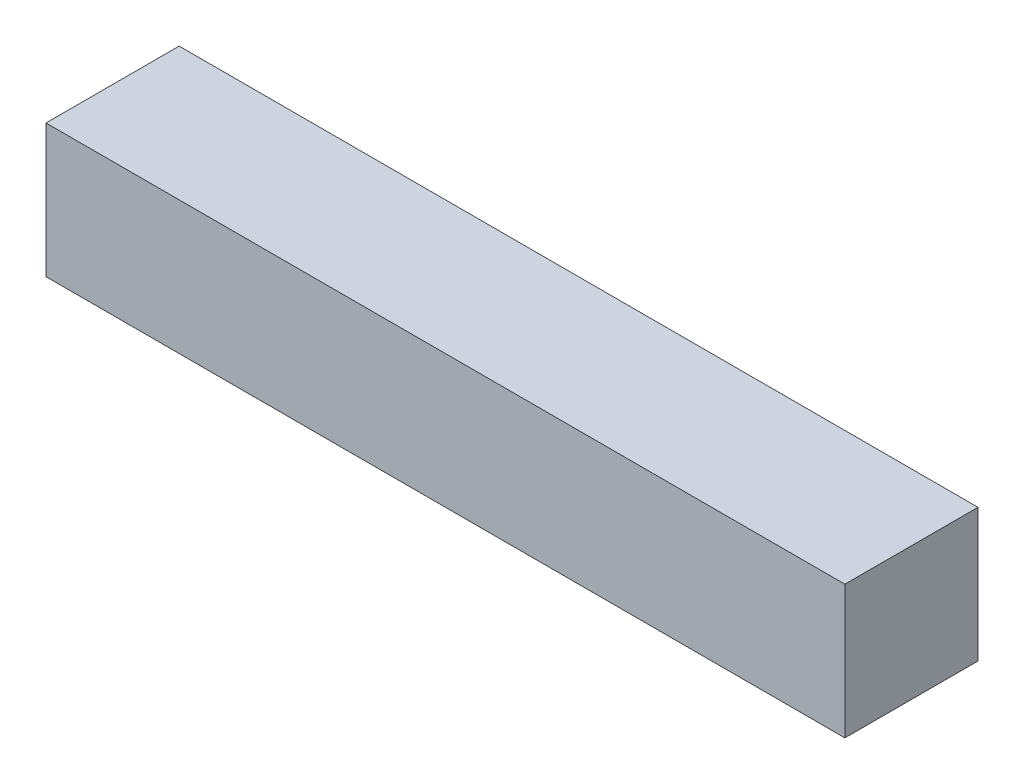
ISO-10303-21;
HEADER;
FILE_DESCRIPTION(('STEP AP214'),'2;1');
FILE_NAME('part.step','',(''),(''),'','','');
FILE_SCHEMA(('AUTOMOTIVE_DESIGN { 1 0 10303 214 1 1 1 1 }'));
ENDSEC;
DATA;
#1=APPLICATION_CONTEXT('core data for automotive mechanical design processes');
#2=APPLICATION_PROTOCOL_DEFINITION('international standard','automotive_design',2000,#1);
#3=PRODUCT_CONTEXT('',#1,'mechanical');
#4=PRODUCT('Part','Part','',(#3));
#5=PRODUCT_RELATED_PRODUCT_CATEGORY('part','',(#4));
#6=PRODUCT_DEFINITION_FORMATION('','',#4);
#7=PRODUCT_DEFINITION_CONTEXT('part definition',#1,'design');
#8=PRODUCT_DEFINITION('design','',#6,#7);
#9=PRODUCT_DEFINITION_SHAPE('','',#8);
#10=(LENGTH_UNIT() NAMED_UNIT(*) SI_UNIT(.MILLI.,.METRE.));
#11=(NAMED_UNIT(*) PLANE_ANGLE_UNIT() SI_UNIT($,.RADIAN.));
#12=(NAMED_UNIT(*) SI_UNIT($,.STERADIAN.) SOLID_ANGLE_UNIT());
#13=UNCERTAINTY_MEASURE_WITH_UNIT(LENGTH_MEASURE(1.E-05),#10,'distance_accuracy_value','');
#14=(GEOMETRIC_REPRESENTATION_CONTEXT(3) GLOBAL_UNCERTAINTY_ASSIGNED_CONTEXT((#13)) GLOBAL_UNIT_ASSIGNED_CONTEXT((#10,
#11,#12)) REPRESENTATION_CONTEXT('',''));
#15=CARTESIAN_POINT('',(0.,0.,0.));
#16=DIRECTION('',(0.,0.,1.));
#17=DIRECTION('',(1.,0.,0.));
#18=AXIS2_PLACEMENT_3D('',#15,#16,#17);
#19=CARTESIAN_POINT('',(210.,-35.,70.));
#20=DIRECTION('',(-1.,0.,0.));
#21=DIRECTION('',(0.,0.,1.));
#22=AXIS2_PLACEMENT_3D('',#19,#20,#21);
#23=PLANE('',#22);
#24=DIRECTION('',(0.,1.,0.));
#25=VECTOR('',#24,1.);
#26=CARTESIAN_POINT('',(210.,-35.,0.));
#27=LINE('',#26,#25);
#28=CARTESIAN_POINT('',(210.,-35.,0.));
#29=VERTEX_POINT('',#28);
#30=CARTESIAN_POINT('',(210.,35.,0.));
#31=VERTEX_POINT('',#30);
#32=EDGE_CURVE('E113',#29,#31,#27,.T.);
#33=ORIENTED_EDGE('',*,*,#32,.T.);
#34=DIRECTION('',(0.,0.,-1.));
#35=VECTOR('',#34,1.);
#36=CARTESIAN_POINT('',(210.,35.,70.));
#37=LINE('',#36,#35);
#38=CARTESIAN_POINT('',(210.,35.,70.));
#39=VERTEX_POINT('',#38);
#40=EDGE_CURVE('E11',#39,#31,#37,.T.);
#41=ORIENTED_EDGE('',*,*,#40,.F.);
#42=DIRECTION('',(0.,1.,0.));
#43=VECTOR('',#42,1.);
#44=CARTESIAN_POINT('',(210.,-35.,70.));
#45=LINE('',#44,#43);
#46=CARTESIAN_POINT('',(210.,-35.,70.));
#47=VERTEX_POINT('',#46);
#48=EDGE_CURVE('E97',#47,#39,#45,.T.);
#49=ORIENTED_EDGE('',*,*,#48,.F.);
#50=DIRECTION('',(0.,0.,-1.));
#51=VECTOR('',#50,1.);
#52=CARTESIAN_POINT('',(210.,-35.,70.));
#53=LINE('',#52,#51);
#54=EDGE_CURVE('E109',#47,#29,#53,.T.);
#55=ORIENTED_EDGE('',*,*,#54,.T.);
#56=EDGE_LOOP('',(#33,#41,#49,#55));
#57=FACE_BOUND('',#56,.T.);
#58=ADVANCED_FACE('F45',(#57),#23,.F.);
#59=CARTESIAN_POINT('',(-210.,35.,70.));
#60=DIRECTION('',(0.,-1.,0.));
#61=DIRECTION('',(0.,0.,-1.));
#62=AXIS2_PLACEMENT_3D('',#59,#60,#61);
#63=PLANE('',#62);
#64=DIRECTION('',(-1.,0.,0.));
#65=VECTOR('',#64,1.);
#66=CARTESIAN_POINT('',(-210.,35.,0.));
#67=LINE('',#66,#65);
#68=CARTESIAN_POINT('',(-210.,35.,0.));
#69=VERTEX_POINT('',#68);
#70=EDGE_CURVE('E102',#31,#69,#67,.T.);
#71=ORIENTED_EDGE('',*,*,#70,.T.);
#72=DIRECTION('',(0.,0.,-1.));
#73=VECTOR('',#72,1.);
#74=CARTESIAN_POINT('',(-210.,35.,70.));
#75=LINE('',#74,#73);
#76=CARTESIAN_POINT('',(-210.,35.,70.));
#77=VERTEX_POINT('',#76);
#78=EDGE_CURVE('E54',#77,#69,#75,.T.);
#79=ORIENTED_EDGE('',*,*,#78,.F.);
#80=DIRECTION('',(-1.,0.,0.));
#81=VECTOR('',#80,1.);
#82=CARTESIAN_POINT('',(-210.,35.,70.));
#83=LINE('',#82,#81);
#84=EDGE_CURVE('E92',#39,#77,#83,.T.);
#85=ORIENTED_EDGE('',*,*,#84,.F.);
#86=ORIENTED_EDGE('',*,*,#40,.T.);
#87=EDGE_LOOP('',(#71,#79,#85,#86));
#88=FACE_BOUND('',#87,.T.);
#89=ADVANCED_FACE('F101',(#88),#63,.F.);
#90=CARTESIAN_POINT('',(-210.,-35.,70.));
#91=DIRECTION('',(1.,0.,0.));
#92=DIRECTION('',(0.,0.,-1.));
#93=AXIS2_PLACEMENT_3D('',#90,#91,#92);
#94=PLANE('',#93);
#95=DIRECTION('',(0.,-1.,0.));
#96=VECTOR('',#95,1.);
#97=CARTESIAN_POINT('',(-210.,-35.,0.));
#98=LINE('',#97,#96);
#99=CARTESIAN_POINT('',(-210.,-35.,0.));
#100=VERTEX_POINT('',#99);
#101=EDGE_CURVE('E79',#69,#100,#98,.T.);
#102=ORIENTED_EDGE('',*,*,#101,.T.);
#103=DIRECTION('',(0.,0.,-1.));
#104=VECTOR('',#103,1.);
#105=CARTESIAN_POINT('',(-210.,-35.,70.));
#106=LINE('',#105,#104);
#107=CARTESIAN_POINT('',(-210.,-35.,70.));
#108=VERTEX_POINT('',#107);
#109=EDGE_CURVE('E104',#108,#100,#106,.T.);
#110=ORIENTED_EDGE('',*,*,#109,.F.);
#111=DIRECTION('',(0.,-1.,0.));
#112=VECTOR('',#111,1.);
#113=CARTESIAN_POINT('',(-210.,-35.,70.));
#114=LINE('',#113,#112);
#115=EDGE_CURVE('E95',#77,#108,#114,.T.);
#116=ORIENTED_EDGE('',*,*,#115,.F.);
#117=ORIENTED_EDGE('',*,*,#78,.T.);
#118=EDGE_LOOP('',(#102,#110,#116,#117));
#119=FACE_BOUND('',#118,.T.);
#120=ADVANCED_FACE('F105',(#119),#94,.F.);
#121=CARTESIAN_POINT('',(-210.,-35.,70.));
#122=DIRECTION('',(0.,1.,0.));
#123=DIRECTION('',(0.,0.,1.));
#124=AXIS2_PLACEMENT_3D('',#121,#122,#123);
#125=PLANE('',#124);
#126=DIRECTION('',(1.,0.,0.));
#127=VECTOR('',#126,1.);
#128=CARTESIAN_POINT('',(-210.,-35.,0.));
#129=LINE('',#128,#127);
#130=EDGE_CURVE('E85',#100,#29,#129,.T.);
#131=ORIENTED_EDGE('',*,*,#130,.T.);
#132=ORIENTED_EDGE('',*,*,#54,.F.);
#133=DIRECTION('',(1.,0.,0.));
#134=VECTOR('',#133,1.);
#135=CARTESIAN_POINT('',(-210.,-35.,70.));
#136=LINE('',#135,#134);
#137=EDGE_CURVE('E62',#108,#47,#136,.T.);
#138=ORIENTED_EDGE('',*,*,#137,.F.);
#139=ORIENTED_EDGE('',*,*,#109,.T.);
#140=EDGE_LOOP('',(#131,#132,#138,#139));
#141=FACE_BOUND('',#140,.T.);
#142=ADVANCED_FACE('F126',(#141),#125,.F.);
#143=CARTESIAN_POINT('',(0.,0.,70.));
#144=DIRECTION('',(0.,0.,-1.));
#145=DIRECTION('',(-1.,0.,0.));
#146=AXIS2_PLACEMENT_3D('',#143,#144,#145);
#147=PLANE('',#146);
#148=ORIENTED_EDGE('',*,*,#48,.T.);
#149=ORIENTED_EDGE('',*,*,#84,.T.);
#150=ORIENTED_EDGE('',*,*,#115,.T.);
#151=ORIENTED_EDGE('',*,*,#137,.T.);
#152=EDGE_LOOP('',(#148,#149,#150,#151));
#153=FACE_BOUND('',#152,.T.);
#154=ADVANCED_FACE('F93',(#153),#147,.F.);
#155=CARTESIAN_POINT('',(0.,0.,0.));
#156=DIRECTION('',(0.,0.,-1.));
#157=DIRECTION('',(-1.,0.,0.));
#158=AXIS2_PLACEMENT_3D('',#155,#156,#157);
#159=PLANE('',#158);
#160=ORIENTED_EDGE('',*,*,#32,.F.);
#161=ORIENTED_EDGE('',*,*,#130,.F.);
#162=ORIENTED_EDGE('',*,*,#101,.F.);
#163=ORIENTED_EDGE('',*,*,#70,.F.);
#164=EDGE_LOOP('',(#160,#161,#162,#163));
#165=FACE_BOUND('',#164,.T.);
#166=ADVANCED_FACE('F129',(#165),#159,.T.);
#167=CLOSED_SHELL('',(#58,#89,#120,#142,#154,#166));
#168=MANIFOLD_SOLID_BREP('B2',#167);
#169=ADVANCED_BREP_SHAPE_REPRESENTATION('',(#18,#168),#14);
#170=SHAPE_DEFINITION_REPRESENTATION(#9,#169);
ENDSEC;
END-ISO-10303-21;
